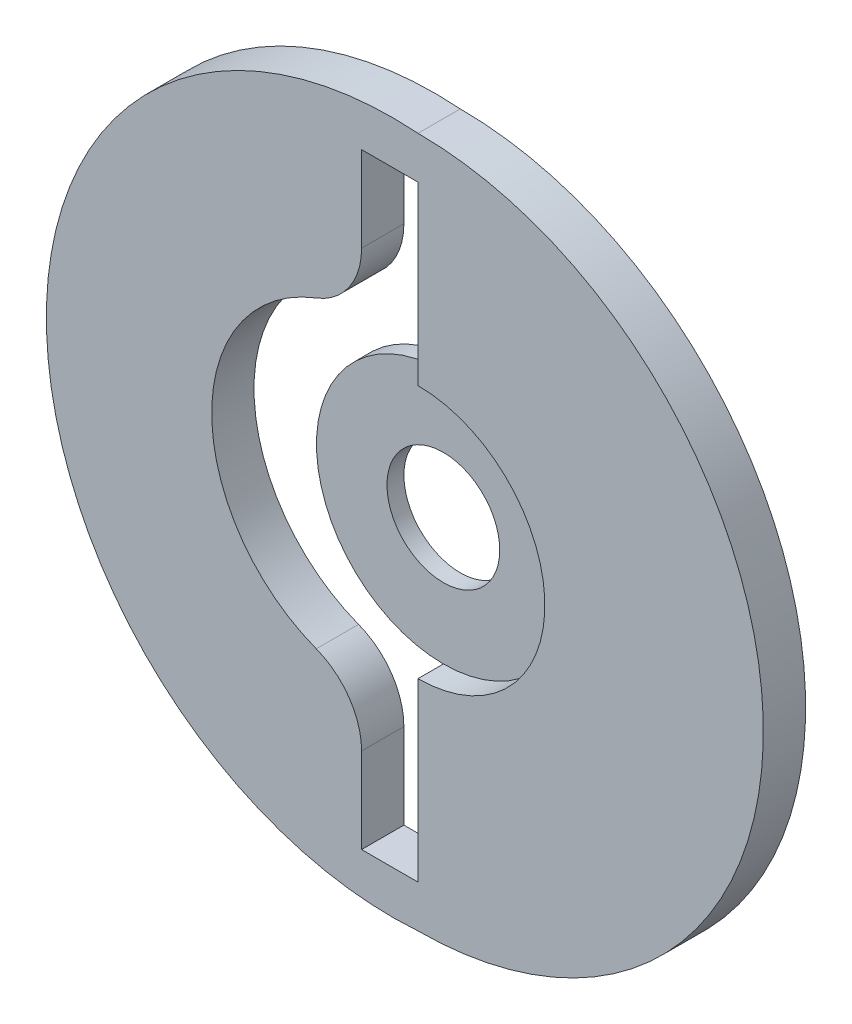
ISO-10303-21;
HEADER;
FILE_DESCRIPTION(('STEP AP214'),'2;1');
FILE_NAME('part.step','',(''),(''),'','','');
FILE_SCHEMA(('AUTOMOTIVE_DESIGN { 1 0 10303 214 1 1 1 1 }'));
ENDSEC;
DATA;
#1=APPLICATION_CONTEXT('core data for automotive mechanical design processes');
#2=APPLICATION_PROTOCOL_DEFINITION('international standard','automotive_design',2000,#1);
#3=PRODUCT_CONTEXT('',#1,'mechanical');
#4=PRODUCT('Part','Part','',(#3));
#5=PRODUCT_RELATED_PRODUCT_CATEGORY('part','',(#4));
#6=PRODUCT_DEFINITION_FORMATION('','',#4);
#7=PRODUCT_DEFINITION_CONTEXT('part definition',#1,'design');
#8=PRODUCT_DEFINITION('design','',#6,#7);
#9=PRODUCT_DEFINITION_SHAPE('','',#8);
#10=(LENGTH_UNIT() NAMED_UNIT(*) SI_UNIT(.MILLI.,.METRE.));
#11=(NAMED_UNIT(*) PLANE_ANGLE_UNIT() SI_UNIT($,.RADIAN.));
#12=(NAMED_UNIT(*) SI_UNIT($,.STERADIAN.) SOLID_ANGLE_UNIT());
#13=UNCERTAINTY_MEASURE_WITH_UNIT(LENGTH_MEASURE(1.E-05),#10,'distance_accuracy_value','');
#14=(GEOMETRIC_REPRESENTATION_CONTEXT(3) GLOBAL_UNCERTAINTY_ASSIGNED_CONTEXT((#13)) GLOBAL_UNIT_ASSIGNED_CONTEXT((#10,
#11,#12)) REPRESENTATION_CONTEXT('',''));
#15=CARTESIAN_POINT('',(0.,0.,0.));
#16=DIRECTION('',(0.,0.,1.));
#17=DIRECTION('',(1.,0.,0.));
#18=AXIS2_PLACEMENT_3D('',#15,#16,#17);
#19=CARTESIAN_POINT('',(-39.3103765754581,-4.62700964630226,3.));
#20=DIRECTION('',(0.,0.,-1.));
#21=DIRECTION('',(-1.,0.,0.));
#22=AXIS2_PLACEMENT_3D('',#19,#20,#21);
#23=CYLINDRICAL_SURFACE('',#22,4.);
#24=CARTESIAN_POINT('',(-39.3103765754581,-4.62700964630226,0.));
#25=DIRECTION('',(0.,0.,-1.));
#26=DIRECTION('',(-1.,0.,0.));
#27=AXIS2_PLACEMENT_3D('',#24,#25,#26);
#28=CIRCLE('',#27,4.);
#29=CARTESIAN_POINT('',(-43.3103765754581,-4.62700964630226,0.));
#30=VERTEX_POINT('',#29);
#31=EDGE_CURVE('E219',#30,#30,#28,.T.);
#32=ORIENTED_EDGE('',*,*,#31,.T.);
#33=EDGE_LOOP('',(#32));
#34=FACE_BOUND('',#33,.T.);
#35=CARTESIAN_POINT('',(-39.3103765754581,-4.62700964630226,1.2));
#36=DIRECTION('',(0.,0.,1.));
#37=DIRECTION('',(1.,0.,0.));
#38=AXIS2_PLACEMENT_3D('',#35,#36,#37);
#39=CIRCLE('',#38,4.);
#40=CARTESIAN_POINT('',(-35.3103765754581,-4.62700964630226,1.2));
#41=VERTEX_POINT('',#40);
#42=EDGE_CURVE('E137',#41,#41,#39,.F.);
#43=ORIENTED_EDGE('',*,*,#42,.F.);
#44=EDGE_LOOP('',(#43));
#45=FACE_BOUND('',#44,.T.);
#46=ADVANCED_FACE('F33',(#34,#45),#23,.F.);
#47=CARTESIAN_POINT('',(-39.3103765754581,-4.62700964630226,3.));
#48=DIRECTION('',(0.,0.,-1.));
#49=DIRECTION('',(-1.,0.,0.));
#50=AXIS2_PLACEMENT_3D('',#47,#48,#49);
#51=CYLINDRICAL_SURFACE('',#50,24.5);
#52=CARTESIAN_POINT('',(-39.3103765754581,-4.62700964630226,0.));
#53=DIRECTION('',(0.,0.,1.));
#54=DIRECTION('',(-1.,0.,0.));
#55=AXIS2_PLACEMENT_3D('',#52,#53,#54);
#56=CIRCLE('',#55,24.5);
#57=CARTESIAN_POINT('',(-39.3103765754581,-29.1270096463023,0.));
#58=VERTEX_POINT('',#57);
#59=CARTESIAN_POINT('',(-39.3103765754581,19.8729903536977,0.));
#60=VERTEX_POINT('',#59);
#61=EDGE_CURVE('E127',#58,#60,#56,.T.);
#62=ORIENTED_EDGE('',*,*,#61,.T.);
#63=DIRECTION('',(0.,0.,-1.));
#64=VECTOR('',#63,1.);
#65=CARTESIAN_POINT('',(-39.3103765754581,19.8729903536977,3.));
#66=LINE('',#65,#64);
#67=CARTESIAN_POINT('',(-39.3103765754581,19.8729903536977,3.));
#68=VERTEX_POINT('',#67);
#69=EDGE_CURVE('E146',#68,#60,#66,.T.);
#70=ORIENTED_EDGE('',*,*,#69,.F.);
#71=CARTESIAN_POINT('',(-39.3103765754581,-4.62700964630226,3.));
#72=DIRECTION('',(0.,0.,1.));
#73=DIRECTION('',(-1.,0.,0.));
#74=AXIS2_PLACEMENT_3D('',#71,#72,#73);
#75=CIRCLE('',#74,24.5);
#76=CARTESIAN_POINT('',(-39.3103765754581,-29.1270096463023,3.));
#77=VERTEX_POINT('',#76);
#78=EDGE_CURVE('E142',#77,#68,#75,.T.);
#79=ORIENTED_EDGE('',*,*,#78,.F.);
#80=DIRECTION('',(0.,0.,-1.));
#81=VECTOR('',#80,1.);
#82=CARTESIAN_POINT('',(-39.3103765754581,-29.1270096463023,3.));
#83=LINE('',#82,#81);
#84=EDGE_CURVE('E140',#77,#58,#83,.T.);
#85=ORIENTED_EDGE('',*,*,#84,.T.);
#86=EDGE_LOOP('',(#62,#70,#79,#85));
#87=FACE_BOUND('',#86,.T.);
#88=ADVANCED_FACE('F141',(#87),#51,.T.);
#89=CARTESIAN_POINT('',(-39.3103765754581,-0.627009646302256,3.));
#90=DIRECTION('',(1.,0.,0.));
#91=DIRECTION('',(0.,0.,-1.));
#92=AXIS2_PLACEMENT_3D('',#89,#90,#91);
#93=PLANE('',#92);
#94=DIRECTION('',(0.,-1.,0.));
#95=VECTOR('',#94,1.);
#96=CARTESIAN_POINT('',(-39.3103765754581,-0.627009646302256,3.));
#97=LINE('',#96,#95);
#98=CARTESIAN_POINT('',(-39.3103765754581,16.8729903536977,3.));
#99=VERTEX_POINT('',#98);
#100=CARTESIAN_POINT('',(-39.3103765754581,4.37299035369775,3.));
#101=VERTEX_POINT('',#100);
#102=EDGE_CURVE('E213',#99,#101,#97,.T.);
#103=ORIENTED_EDGE('',*,*,#102,.F.);
#104=DIRECTION('',(0.,0.,1.));
#105=VECTOR('',#104,1.);
#106=CARTESIAN_POINT('',(-39.3103765754581,16.8729903536977,0.));
#107=LINE('',#106,#105);
#108=CARTESIAN_POINT('',(-39.3103765754581,16.8729903536977,0.));
#109=VERTEX_POINT('',#108);
#110=EDGE_CURVE('E182',#109,#99,#107,.T.);
#111=ORIENTED_EDGE('',*,*,#110,.F.);
#112=DIRECTION('',(0.,-1.,0.));
#113=VECTOR('',#112,1.);
#114=CARTESIAN_POINT('',(-39.3103765754581,-0.627009646302256,0.));
#115=LINE('',#114,#113);
#116=CARTESIAN_POINT('',(-39.3103765754581,4.37299035369775,0.));
#117=VERTEX_POINT('',#116);
#118=EDGE_CURVE('E136',#109,#117,#115,.T.);
#119=ORIENTED_EDGE('',*,*,#118,.T.);
#120=DIRECTION('',(0.,0.,1.));
#121=VECTOR('',#120,1.);
#122=CARTESIAN_POINT('',(-39.3103765754581,4.37299035369775,0.));
#123=LINE('',#122,#121);
#124=CARTESIAN_POINT('',(-39.3103765754581,4.37299035369775,1.2));
#125=VERTEX_POINT('',#124);
#126=EDGE_CURVE('E196',#117,#125,#123,.T.);
#127=ORIENTED_EDGE('',*,*,#126,.T.);
#128=DIRECTION('',(0.,0.,1.));
#129=VECTOR('',#128,1.);
#130=CARTESIAN_POINT('',(-39.3103765754581,4.37299035369775,1.2));
#131=LINE('',#130,#129);
#132=EDGE_CURVE('E207',#125,#101,#131,.T.);
#133=ORIENTED_EDGE('',*,*,#132,.T.);
#134=EDGE_LOOP('',(#103,#111,#119,#127,#133));
#135=FACE_BOUND('',#134,.T.);
#136=ADVANCED_FACE('F271',(#135),#93,.F.);
#137=CARTESIAN_POINT('',(-39.3103765754581,-8.62700964630226,3.));
#138=DIRECTION('',(1.,0.,0.));
#139=DIRECTION('',(0.,1.,0.));
#140=AXIS2_PLACEMENT_3D('',#137,#138,#139);
#141=PLANE('',#140);
#142=DIRECTION('',(0.,-1.,0.));
#143=VECTOR('',#142,1.);
#144=CARTESIAN_POINT('',(-39.3103765754581,-8.62700964630226,0.));
#145=LINE('',#144,#143);
#146=CARTESIAN_POINT('',(-39.3103765754581,-13.6270096463023,0.));
#147=VERTEX_POINT('',#146);
#148=CARTESIAN_POINT('',(-39.3103765754581,-26.1270096463023,0.));
#149=VERTEX_POINT('',#148);
#150=EDGE_CURVE('E214',#147,#149,#145,.T.);
#151=ORIENTED_EDGE('',*,*,#150,.T.);
#152=DIRECTION('',(0.,0.,1.));
#153=VECTOR('',#152,1.);
#154=CARTESIAN_POINT('',(-39.3103765754581,-26.1270096463023,0.));
#155=LINE('',#154,#153);
#156=CARTESIAN_POINT('',(-39.3103765754581,-26.1270096463023,3.));
#157=VERTEX_POINT('',#156);
#158=EDGE_CURVE('E169',#149,#157,#155,.T.);
#159=ORIENTED_EDGE('',*,*,#158,.T.);
#160=DIRECTION('',(0.,-1.,0.));
#161=VECTOR('',#160,1.);
#162=CARTESIAN_POINT('',(-39.3103765754581,-8.62700964630226,3.));
#163=LINE('',#162,#161);
#164=CARTESIAN_POINT('',(-39.3103765754581,-13.6270096463023,3.));
#165=VERTEX_POINT('',#164);
#166=EDGE_CURVE('E147',#165,#157,#163,.T.);
#167=ORIENTED_EDGE('',*,*,#166,.F.);
#168=DIRECTION('',(0.,0.,1.));
#169=VECTOR('',#168,1.);
#170=CARTESIAN_POINT('',(-39.3103765754581,-13.6270096463023,1.2));
#171=LINE('',#170,#169);
#172=CARTESIAN_POINT('',(-39.3103765754581,-13.6270096463023,1.2));
#173=VERTEX_POINT('',#172);
#174=EDGE_CURVE('E204',#165,#173,#171,.F.);
#175=ORIENTED_EDGE('',*,*,#174,.T.);
#176=DIRECTION('',(0.,0.,1.));
#177=VECTOR('',#176,1.);
#178=CARTESIAN_POINT('',(-39.3103765754581,-13.6270096463023,0.));
#179=LINE('',#178,#177);
#180=EDGE_CURVE('E194',#147,#173,#179,.T.);
#181=ORIENTED_EDGE('',*,*,#180,.F.);
#182=EDGE_LOOP('',(#151,#159,#167,#175,#181));
#183=FACE_BOUND('',#182,.T.);
#184=ADVANCED_FACE('F280',(#183),#141,.F.);
#185=CARTESIAN_POINT('',(-39.3103765754581,-4.62700964630226,3.));
#186=DIRECTION('',(0.,0.,-1.));
#187=DIRECTION('',(-1.,0.,0.));
#188=AXIS2_PLACEMENT_3D('',#185,#186,#187);
#189=PLANE('',#188);
#190=DIRECTION('',(0.,1.,0.));
#191=VECTOR('',#190,1.);
#192=CARTESIAN_POINT('',(-43.3103765754581,-26.1270096463023,3.));
#193=LINE('',#192,#191);
#194=CARTESIAN_POINT('',(-43.3103765754581,-26.1270096463023,3.));
#195=VERTEX_POINT('',#194);
#196=CARTESIAN_POINT('',(-43.3103765754581,-20.0729889447673,3.));
#197=VERTEX_POINT('',#196);
#198=EDGE_CURVE('E175',#195,#197,#193,.T.);
#199=ORIENTED_EDGE('',*,*,#198,.T.);
#200=CARTESIAN_POINT('',(-48.3103765754581,-20.0729889447673,3.));
#201=DIRECTION('',(0.,0.,-1.));
#202=DIRECTION('',(-1.,0.,0.));
#203=AXIS2_PLACEMENT_3D('',#200,#201,#202);
#204=CIRCLE('',#203,5.);
#205=CARTESIAN_POINT('',(-46.5255550206896,-15.4023988302707,3.));
#206=VERTEX_POINT('',#205);
#207=EDGE_CURVE('E232',#197,#206,#204,.F.);
#208=ORIENTED_EDGE('',*,*,#207,.T.);
#209=CARTESIAN_POINT('',(-42.4078426106726,-4.62700964630226,3.));
#210=DIRECTION('',(0.,0.,-1.));
#211=DIRECTION('',(1.,0.,0.));
#212=AXIS2_PLACEMENT_3D('',#209,#210,#211);
#213=CIRCLE('',#212,11.5353616136466);
#214=CARTESIAN_POINT('',(-46.5255550206896,6.14837953766614,3.));
#215=VERTEX_POINT('',#214);
#216=EDGE_CURVE('E178',#206,#215,#213,.T.);
#217=ORIENTED_EDGE('',*,*,#216,.T.);
#218=CARTESIAN_POINT('',(-48.3103765754581,10.8189696521628,3.));
#219=DIRECTION('',(0.,0.,-1.));
#220=DIRECTION('',(-1.,0.,0.));
#221=AXIS2_PLACEMENT_3D('',#218,#219,#220);
#222=CIRCLE('',#221,5.);
#223=CARTESIAN_POINT('',(-43.3103765754581,10.8189696521628,3.));
#224=VERTEX_POINT('',#223);
#225=EDGE_CURVE('E230',#215,#224,#222,.F.);
#226=ORIENTED_EDGE('',*,*,#225,.T.);
#227=DIRECTION('',(0.,1.,0.));
#228=VECTOR('',#227,1.);
#229=CARTESIAN_POINT('',(-43.3103765754581,16.8729903536977,3.));
#230=LINE('',#229,#228);
#231=CARTESIAN_POINT('',(-43.3103765754581,16.8729903536977,3.));
#232=VERTEX_POINT('',#231);
#233=EDGE_CURVE('E157',#224,#232,#230,.T.);
#234=ORIENTED_EDGE('',*,*,#233,.T.);
#235=DIRECTION('',(1.,0.,0.));
#236=VECTOR('',#235,1.);
#237=CARTESIAN_POINT('',(-39.3103765754581,16.8729903536977,3.));
#238=LINE('',#237,#236);
#239=EDGE_CURVE('E151',#232,#99,#238,.T.);
#240=ORIENTED_EDGE('',*,*,#239,.T.);
#241=ORIENTED_EDGE('',*,*,#102,.T.);
#242=CARTESIAN_POINT('',(-39.3103765754581,-4.62700964630226,3.));
#243=DIRECTION('',(0.,0.,-1.));
#244=DIRECTION('',(-1.,0.,0.));
#245=AXIS2_PLACEMENT_3D('',#242,#243,#244);
#246=CIRCLE('',#245,9.);
#247=EDGE_CURVE('E224',#101,#165,#246,.T.);
#248=ORIENTED_EDGE('',*,*,#247,.T.);
#249=ORIENTED_EDGE('',*,*,#166,.T.);
#250=DIRECTION('',(-1.,0.,0.));
#251=VECTOR('',#250,1.);
#252=CARTESIAN_POINT('',(-39.3103765754581,-26.1270096463023,3.));
#253=LINE('',#252,#251);
#254=EDGE_CURVE('E172',#157,#195,#253,.T.);
#255=ORIENTED_EDGE('',*,*,#254,.T.);
#256=EDGE_LOOP('',(#199,#208,#217,#226,#234,#240,#241,#248,#249,#255));
#257=FACE_BOUND('',#256,.T.);
#258=ORIENTED_EDGE('',*,*,#78,.T.);
#259=CARTESIAN_POINT('',(-41.1074191840038,-4.62700964630226,3.));
#260=DIRECTION('',(0.,0.,1.));
#261=DIRECTION('',(1.,0.,0.));
#262=AXIS2_PLACEMENT_3D('',#259,#260,#261);
#263=CIRCLE('',#262,24.56581694422);
#264=EDGE_CURVE('E170',#68,#77,#263,.T.);
#265=ORIENTED_EDGE('',*,*,#264,.T.);
#266=EDGE_LOOP('',(#258,#265));
#267=FACE_BOUND('',#266,.T.);
#268=ADVANCED_FACE('F251',(#257,#267),#189,.F.);
#269=CARTESIAN_POINT('',(-39.3103765754581,-4.62700964630226,0.));
#270=DIRECTION('',(0.,0.,-1.));
#271=DIRECTION('',(-1.,0.,0.));
#272=AXIS2_PLACEMENT_3D('',#269,#270,#271);
#273=PLANE('',#272);
#274=CARTESIAN_POINT('',(-42.4078426106726,-4.62700964630226,0.));
#275=DIRECTION('',(0.,0.,-1.));
#276=DIRECTION('',(1.,0.,0.));
#277=AXIS2_PLACEMENT_3D('',#274,#275,#276);
#278=CIRCLE('',#277,11.5353616136466);
#279=CARTESIAN_POINT('',(-46.5255550206896,-15.4023988302707,0.));
#280=VERTEX_POINT('',#279);
#281=CARTESIAN_POINT('',(-46.5255550206896,6.14837953766614,0.));
#282=VERTEX_POINT('',#281);
#283=EDGE_CURVE('E162',#280,#282,#278,.T.);
#284=ORIENTED_EDGE('',*,*,#283,.F.);
#285=CARTESIAN_POINT('',(-48.3103765754581,-20.0729889447673,0.));
#286=DIRECTION('',(0.,0.,-1.));
#287=DIRECTION('',(-1.,0.,0.));
#288=AXIS2_PLACEMENT_3D('',#285,#286,#287);
#289=CIRCLE('',#288,5.);
#290=CARTESIAN_POINT('',(-43.3103765754581,-20.0729889447673,0.));
#291=VERTEX_POINT('',#290);
#292=EDGE_CURVE('E41',#280,#291,#289,.T.);
#293=ORIENTED_EDGE('',*,*,#292,.T.);
#294=DIRECTION('',(0.,1.,0.));
#295=VECTOR('',#294,1.);
#296=CARTESIAN_POINT('',(-43.3103765754581,-26.1270096463023,0.));
#297=LINE('',#296,#295);
#298=CARTESIAN_POINT('',(-43.3103765754581,-26.1270096463023,0.));
#299=VERTEX_POINT('',#298);
#300=EDGE_CURVE('E154',#299,#291,#297,.T.);
#301=ORIENTED_EDGE('',*,*,#300,.F.);
#302=DIRECTION('',(-1.,0.,0.));
#303=VECTOR('',#302,1.);
#304=CARTESIAN_POINT('',(-39.3103765754581,-26.1270096463023,0.));
#305=LINE('',#304,#303);
#306=EDGE_CURVE('E150',#149,#299,#305,.T.);
#307=ORIENTED_EDGE('',*,*,#306,.F.);
#308=ORIENTED_EDGE('',*,*,#150,.F.);
#309=CARTESIAN_POINT('',(-39.3103765754581,-4.62700964630226,0.));
#310=DIRECTION('',(0.,0.,1.));
#311=DIRECTION('',(1.,0.,0.));
#312=AXIS2_PLACEMENT_3D('',#309,#310,#311);
#313=CIRCLE('',#312,9.);
#314=EDGE_CURVE('E192',#117,#147,#313,.T.);
#315=ORIENTED_EDGE('',*,*,#314,.F.);
#316=ORIENTED_EDGE('',*,*,#118,.F.);
#317=DIRECTION('',(1.,0.,0.));
#318=VECTOR('',#317,1.);
#319=CARTESIAN_POINT('',(-39.3103765754581,16.8729903536977,0.));
#320=LINE('',#319,#318);
#321=CARTESIAN_POINT('',(-43.3103765754581,16.8729903536977,0.));
#322=VERTEX_POINT('',#321);
#323=EDGE_CURVE('E166',#322,#109,#320,.T.);
#324=ORIENTED_EDGE('',*,*,#323,.F.);
#325=DIRECTION('',(0.,1.,0.));
#326=VECTOR('',#325,1.);
#327=CARTESIAN_POINT('',(-43.3103765754581,16.8729903536977,0.));
#328=LINE('',#327,#326);
#329=CARTESIAN_POINT('',(-43.3103765754581,10.8189696521628,0.));
#330=VERTEX_POINT('',#329);
#331=EDGE_CURVE('E164',#330,#322,#328,.T.);
#332=ORIENTED_EDGE('',*,*,#331,.F.);
#333=CARTESIAN_POINT('',(-48.3103765754581,10.8189696521628,0.));
#334=DIRECTION('',(0.,0.,-1.));
#335=DIRECTION('',(-1.,0.,0.));
#336=AXIS2_PLACEMENT_3D('',#333,#334,#335);
#337=CIRCLE('',#336,5.);
#338=EDGE_CURVE('E53',#330,#282,#337,.T.);
#339=ORIENTED_EDGE('',*,*,#338,.T.);
#340=EDGE_LOOP('',(#284,#293,#301,#307,#308,#315,#316,#324,#332,#339));
#341=FACE_BOUND('',#340,.T.);
#342=CARTESIAN_POINT('',(-41.1074191840038,-4.62700964630226,0.));
#343=DIRECTION('',(0.,0.,1.));
#344=DIRECTION('',(1.,0.,0.));
#345=AXIS2_PLACEMENT_3D('',#342,#343,#344);
#346=CIRCLE('',#345,24.56581694422);
#347=EDGE_CURVE('E132',#60,#58,#346,.T.);
#348=ORIENTED_EDGE('',*,*,#347,.F.);
#349=ORIENTED_EDGE('',*,*,#61,.F.);
#350=EDGE_LOOP('',(#348,#349));
#351=FACE_BOUND('',#350,.T.);
#352=ORIENTED_EDGE('',*,*,#31,.F.);
#353=EDGE_LOOP('',(#352));
#354=FACE_BOUND('',#353,.T.);
#355=ADVANCED_FACE('F129',(#341,#351,#354),#273,.T.);
#356=CARTESIAN_POINT('',(-39.3103765754581,-4.62700964630226,1.2));
#357=DIRECTION('',(0.,0.,1.));
#358=DIRECTION('',(1.,0.,0.));
#359=AXIS2_PLACEMENT_3D('',#356,#357,#358);
#360=PLANE('',#359);
#361=ORIENTED_EDGE('',*,*,#42,.T.);
#362=EDGE_LOOP('',(#361));
#363=FACE_BOUND('',#362,.T.);
#364=CARTESIAN_POINT('',(-39.3103765754581,-4.62700964630226,1.2));
#365=DIRECTION('',(0.,0.,1.));
#366=DIRECTION('',(1.,0.,0.));
#367=AXIS2_PLACEMENT_3D('',#364,#365,#366);
#368=CIRCLE('',#367,9.);
#369=EDGE_CURVE('E199',#173,#125,#368,.T.);
#370=ORIENTED_EDGE('',*,*,#369,.T.);
#371=CARTESIAN_POINT('',(-39.3103765754581,-4.62700964630226,1.2));
#372=DIRECTION('',(0.,0.,1.));
#373=DIRECTION('',(1.,0.,0.));
#374=AXIS2_PLACEMENT_3D('',#371,#372,#373);
#375=CIRCLE('',#374,9.);
#376=EDGE_CURVE('E185',#125,#173,#375,.T.);
#377=ORIENTED_EDGE('',*,*,#376,.T.);
#378=EDGE_LOOP('',(#370,#377));
#379=FACE_BOUND('',#378,.T.);
#380=ADVANCED_FACE('F314',(#363,#379),#360,.T.);
#381=CARTESIAN_POINT('',(-39.3103765754581,-4.62700964630226,1.2));
#382=DIRECTION('',(0.,0.,1.));
#383=DIRECTION('',(1.,0.,0.));
#384=AXIS2_PLACEMENT_3D('',#381,#382,#383);
#385=CYLINDRICAL_SURFACE('',#384,9.);
#386=ORIENTED_EDGE('',*,*,#369,.F.);
#387=ORIENTED_EDGE('',*,*,#174,.F.);
#388=ORIENTED_EDGE('',*,*,#247,.F.);
#389=ORIENTED_EDGE('',*,*,#132,.F.);
#390=EDGE_LOOP('',(#386,#387,#388,#389));
#391=FACE_BOUND('',#390,.T.);
#392=ADVANCED_FACE('F270',(#391),#385,.F.);
#393=CARTESIAN_POINT('',(-39.3103765754581,-4.62700964630226,0.));
#394=DIRECTION('',(0.,0.,1.));
#395=DIRECTION('',(1.,0.,0.));
#396=AXIS2_PLACEMENT_3D('',#393,#394,#395);
#397=CYLINDRICAL_SURFACE('',#396,9.);
#398=ORIENTED_EDGE('',*,*,#376,.F.);
#399=ORIENTED_EDGE('',*,*,#126,.F.);
#400=ORIENTED_EDGE('',*,*,#314,.T.);
#401=ORIENTED_EDGE('',*,*,#180,.T.);
#402=EDGE_LOOP('',(#398,#399,#400,#401));
#403=FACE_BOUND('',#402,.T.);
#404=ADVANCED_FACE('F275',(#403),#397,.T.);
#405=CARTESIAN_POINT('',(-41.1074191840038,-4.62700964630226,0.));
#406=DIRECTION('',(0.,0.,1.));
#407=DIRECTION('',(1.,0.,0.));
#408=AXIS2_PLACEMENT_3D('',#405,#406,#407);
#409=CYLINDRICAL_SURFACE('',#408,24.56581694422);
#410=ORIENTED_EDGE('',*,*,#264,.F.);
#411=ORIENTED_EDGE('',*,*,#69,.T.);
#412=ORIENTED_EDGE('',*,*,#347,.T.);
#413=ORIENTED_EDGE('',*,*,#84,.F.);
#414=EDGE_LOOP('',(#410,#411,#412,#413));
#415=FACE_BOUND('',#414,.T.);
#416=ADVANCED_FACE('F149',(#415),#409,.T.);
#417=CARTESIAN_POINT('',(-39.3103765754581,16.8729903536977,0.));
#418=DIRECTION('',(0.,-1.,0.));
#419=DIRECTION('',(0.,0.,-1.));
#420=AXIS2_PLACEMENT_3D('',#417,#418,#419);
#421=PLANE('',#420);
#422=ORIENTED_EDGE('',*,*,#239,.F.);
#423=DIRECTION('',(0.,0.,1.));
#424=VECTOR('',#423,1.);
#425=CARTESIAN_POINT('',(-43.3103765754581,16.8729903536977,0.));
#426=LINE('',#425,#424);
#427=EDGE_CURVE('E186',#322,#232,#426,.T.);
#428=ORIENTED_EDGE('',*,*,#427,.F.);
#429=ORIENTED_EDGE('',*,*,#323,.T.);
#430=ORIENTED_EDGE('',*,*,#110,.T.);
#431=EDGE_LOOP('',(#422,#428,#429,#430));
#432=FACE_BOUND('',#431,.T.);
#433=ADVANCED_FACE('F262',(#432),#421,.T.);
#434=CARTESIAN_POINT('',(-43.3103765754581,16.8729903536977,0.));
#435=DIRECTION('',(1.,0.,0.));
#436=DIRECTION('',(0.,1.,0.));
#437=AXIS2_PLACEMENT_3D('',#434,#435,#436);
#438=PLANE('',#437);
#439=ORIENTED_EDGE('',*,*,#233,.F.);
#440=DIRECTION('',(0.,0.,1.));
#441=VECTOR('',#440,1.);
#442=CARTESIAN_POINT('',(-43.3103765754581,10.8189696521628,0.));
#443=LINE('',#442,#441);
#444=EDGE_CURVE('E11',#224,#330,#443,.F.);
#445=ORIENTED_EDGE('',*,*,#444,.T.);
#446=ORIENTED_EDGE('',*,*,#331,.T.);
#447=ORIENTED_EDGE('',*,*,#427,.T.);
#448=EDGE_LOOP('',(#439,#445,#446,#447));
#449=FACE_BOUND('',#448,.T.);
#450=ADVANCED_FACE('F257',(#449),#438,.T.);
#451=CARTESIAN_POINT('',(-42.4078426106726,-4.62700964630226,0.));
#452=DIRECTION('',(0.,0.,1.));
#453=DIRECTION('',(1.,0.,0.));
#454=AXIS2_PLACEMENT_3D('',#451,#452,#453);
#455=CYLINDRICAL_SURFACE('',#454,11.5353616136466);
#456=ORIENTED_EDGE('',*,*,#216,.F.);
#457=DIRECTION('',(0.,0.,1.));
#458=VECTOR('',#457,1.);
#459=CARTESIAN_POINT('',(-46.5255550206896,-15.4023988302707,0.));
#460=LINE('',#459,#458);
#461=EDGE_CURVE('E237',#206,#280,#460,.F.);
#462=ORIENTED_EDGE('',*,*,#461,.T.);
#463=ORIENTED_EDGE('',*,*,#283,.T.);
#464=DIRECTION('',(0.,0.,1.));
#465=VECTOR('',#464,1.);
#466=CARTESIAN_POINT('',(-46.5255550206896,6.14837953766615,0.));
#467=LINE('',#466,#465);
#468=EDGE_CURVE('E234',#282,#215,#467,.T.);
#469=ORIENTED_EDGE('',*,*,#468,.T.);
#470=EDGE_LOOP('',(#456,#462,#463,#469));
#471=FACE_BOUND('',#470,.T.);
#472=ADVANCED_FACE('F254',(#471),#455,.F.);
#473=CARTESIAN_POINT('',(-43.3103765754581,-26.1270096463023,0.));
#474=DIRECTION('',(1.,0.,0.));
#475=DIRECTION('',(0.,0.,-1.));
#476=AXIS2_PLACEMENT_3D('',#473,#474,#475);
#477=PLANE('',#476);
#478=ORIENTED_EDGE('',*,*,#300,.T.);
#479=DIRECTION('',(0.,0.,1.));
#480=VECTOR('',#479,1.);
#481=CARTESIAN_POINT('',(-43.3103765754581,-20.0729889447673,0.));
#482=LINE('',#481,#480);
#483=EDGE_CURVE('E227',#291,#197,#482,.T.);
#484=ORIENTED_EDGE('',*,*,#483,.T.);
#485=ORIENTED_EDGE('',*,*,#198,.F.);
#486=DIRECTION('',(0.,0.,1.));
#487=VECTOR('',#486,1.);
#488=CARTESIAN_POINT('',(-43.3103765754581,-26.1270096463023,0.));
#489=LINE('',#488,#487);
#490=EDGE_CURVE('E189',#299,#195,#489,.T.);
#491=ORIENTED_EDGE('',*,*,#490,.F.);
#492=EDGE_LOOP('',(#478,#484,#485,#491));
#493=FACE_BOUND('',#492,.T.);
#494=ADVANCED_FACE('F246',(#493),#477,.T.);
#495=CARTESIAN_POINT('',(-39.3103765754581,-26.1270096463023,0.));
#496=DIRECTION('',(0.,1.,0.));
#497=DIRECTION('',(0.,0.,1.));
#498=AXIS2_PLACEMENT_3D('',#495,#496,#497);
#499=PLANE('',#498);
#500=ORIENTED_EDGE('',*,*,#254,.F.);
#501=ORIENTED_EDGE('',*,*,#158,.F.);
#502=ORIENTED_EDGE('',*,*,#306,.T.);
#503=ORIENTED_EDGE('',*,*,#490,.T.);
#504=EDGE_LOOP('',(#500,#501,#502,#503));
#505=FACE_BOUND('',#504,.T.);
#506=ADVANCED_FACE('F283',(#505),#499,.T.);
#507=CARTESIAN_POINT('',(-48.3103765754581,-20.0729889447673,0.));
#508=DIRECTION('',(0.,0.,1.));
#509=DIRECTION('',(1.,0.,0.));
#510=AXIS2_PLACEMENT_3D('',#507,#508,#509);
#511=CYLINDRICAL_SURFACE('',#510,5.);
#512=ORIENTED_EDGE('',*,*,#292,.F.);
#513=ORIENTED_EDGE('',*,*,#461,.F.);
#514=ORIENTED_EDGE('',*,*,#207,.F.);
#515=ORIENTED_EDGE('',*,*,#483,.F.);
#516=EDGE_LOOP('',(#512,#513,#514,#515));
#517=FACE_BOUND('',#516,.T.);
#518=ADVANCED_FACE('F248',(#517),#511,.T.);
#519=CARTESIAN_POINT('',(-48.3103765754581,10.8189696521628,0.));
#520=DIRECTION('',(0.,0.,1.));
#521=DIRECTION('',(1.,0.,0.));
#522=AXIS2_PLACEMENT_3D('',#519,#520,#521);
#523=CYLINDRICAL_SURFACE('',#522,5.);
#524=ORIENTED_EDGE('',*,*,#338,.F.);
#525=ORIENTED_EDGE('',*,*,#444,.F.);
#526=ORIENTED_EDGE('',*,*,#225,.F.);
#527=ORIENTED_EDGE('',*,*,#468,.F.);
#528=EDGE_LOOP('',(#524,#525,#526,#527));
#529=FACE_BOUND('',#528,.T.);
#530=ADVANCED_FACE('F35',(#529),#523,.T.);
#531=CLOSED_SHELL('',(#46,#88,#136,#184,#268,#355,#380,#392,#404,#416,#433,#450,#472,#494,#506,
#518,#530));
#532=MANIFOLD_SOLID_BREP('B2',#531);
#533=ADVANCED_BREP_SHAPE_REPRESENTATION('',(#18,#532),#14);
#534=SHAPE_DEFINITION_REPRESENTATION(#9,#533);
ENDSEC;
END-ISO-10303-21;
